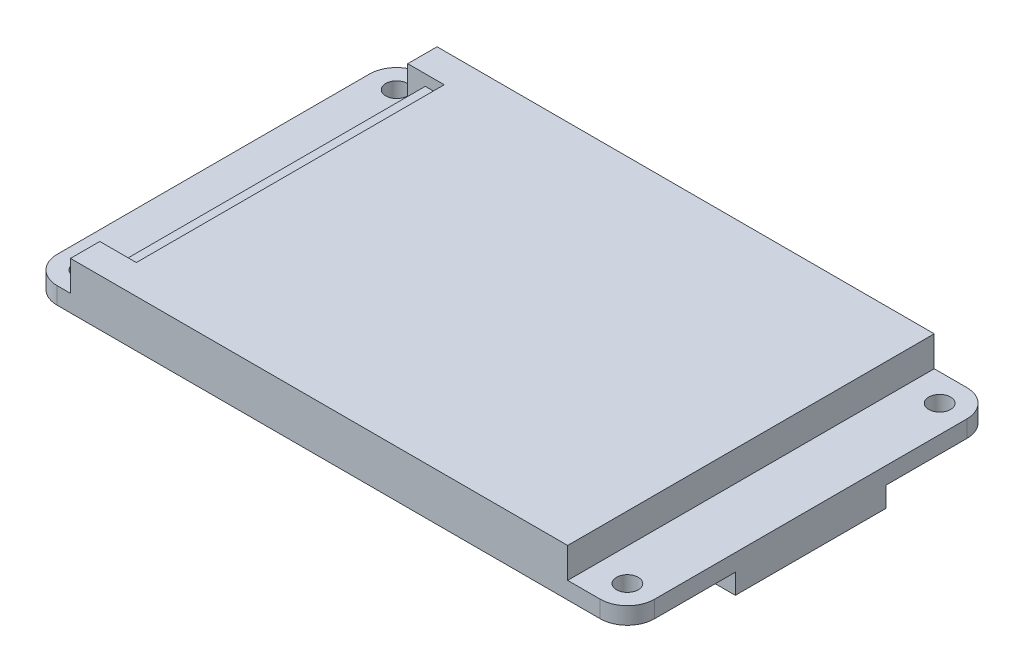
ISO-10303-21;
HEADER;
FILE_DESCRIPTION(('STEP AP214'),'2;1');
FILE_NAME('part.step','',(''),(''),'','','');
FILE_SCHEMA(('AUTOMOTIVE_DESIGN { 1 0 10303 214 1 1 1 1 }'));
ENDSEC;
DATA;
#1=APPLICATION_CONTEXT('core data for automotive mechanical design processes');
#2=APPLICATION_PROTOCOL_DEFINITION('international standard','automotive_design',2000,#1);
#3=PRODUCT_CONTEXT('',#1,'mechanical');
#4=PRODUCT('Part','Part','',(#3));
#5=PRODUCT_RELATED_PRODUCT_CATEGORY('part','',(#4));
#6=PRODUCT_DEFINITION_FORMATION('','',#4);
#7=PRODUCT_DEFINITION_CONTEXT('part definition',#1,'design');
#8=PRODUCT_DEFINITION('design','',#6,#7);
#9=PRODUCT_DEFINITION_SHAPE('','',#8);
#10=(LENGTH_UNIT() NAMED_UNIT(*) SI_UNIT(.MILLI.,.METRE.));
#11=(NAMED_UNIT(*) PLANE_ANGLE_UNIT() SI_UNIT($,.RADIAN.));
#12=(NAMED_UNIT(*) SI_UNIT($,.STERADIAN.) SOLID_ANGLE_UNIT());
#13=UNCERTAINTY_MEASURE_WITH_UNIT(LENGTH_MEASURE(1.E-05),#10,'distance_accuracy_value','');
#14=(GEOMETRIC_REPRESENTATION_CONTEXT(3) GLOBAL_UNCERTAINTY_ASSIGNED_CONTEXT((#13)) GLOBAL_UNIT_ASSIGNED_CONTEXT((#10,
#11,#12)) REPRESENTATION_CONTEXT('',''));
#15=CARTESIAN_POINT('',(0.,0.,0.));
#16=DIRECTION('',(0.,0.,1.));
#17=DIRECTION('',(1.,0.,0.));
#18=AXIS2_PLACEMENT_3D('',#15,#16,#17);
#19=CARTESIAN_POINT('',(53.34,0.,-2.54));
#20=DIRECTION('',(0.,1.,0.));
#21=DIRECTION('',(0.,0.,1.));
#22=AXIS2_PLACEMENT_3D('',#19,#20,#21);
#23=PLANE('',#22);
#24=DIRECTION('',(-1.,0.,0.));
#25=VECTOR('',#24,1.);
#26=CARTESIAN_POINT('',(1.27000000000002,0.,-4.445));
#27=LINE('',#26,#25);
#28=CARTESIAN_POINT('',(3.81000000000002,0.,-4.445));
#29=VERTEX_POINT('',#28);
#30=CARTESIAN_POINT('',(1.27000000000002,0.,-4.445));
#31=VERTEX_POINT('',#30);
#32=EDGE_CURVE('E58',#29,#31,#27,.T.);
#33=ORIENTED_EDGE('',*,*,#32,.F.);
#34=DIRECTION('',(0.,0.,1.));
#35=VECTOR('',#34,1.);
#36=CARTESIAN_POINT('',(3.81000000000002,0.,-29.845));
#37=LINE('',#36,#35);
#38=CARTESIAN_POINT('',(3.81000000000002,0.,-29.845));
#39=VERTEX_POINT('',#38);
#40=EDGE_CURVE('E251',#39,#29,#37,.T.);
#41=ORIENTED_EDGE('',*,*,#40,.F.);
#42=DIRECTION('',(1.,0.,0.));
#43=VECTOR('',#42,1.);
#44=CARTESIAN_POINT('',(1.27000000000002,0.,-29.845));
#45=LINE('',#44,#43);
#46=CARTESIAN_POINT('',(1.27000000000002,0.,-29.845));
#47=VERTEX_POINT('',#46);
#48=EDGE_CURVE('E232',#47,#39,#45,.T.);
#49=ORIENTED_EDGE('',*,*,#48,.F.);
#50=DIRECTION('',(0.,0.,-1.));
#51=VECTOR('',#50,1.);
#52=CARTESIAN_POINT('',(1.27000000000002,0.,-29.845));
#53=LINE('',#52,#51);
#54=EDGE_CURVE('E229',#31,#47,#53,.T.);
#55=ORIENTED_EDGE('',*,*,#54,.F.);
#56=EDGE_LOOP('',(#33,#41,#49,#55));
#57=FACE_BOUND('',#56,.T.);
#58=CARTESIAN_POINT('',(2.54,0.,-2.54));
#59=DIRECTION('',(0.,1.,0.));
#60=DIRECTION('',(0.,0.,1.));
#61=AXIS2_PLACEMENT_3D('',#58,#59,#60);
#62=CIRCLE('',#61,1.016);
#63=CARTESIAN_POINT('',(2.54,0.,-1.524));
#64=VERTEX_POINT('',#63);
#65=EDGE_CURVE('E274',#64,#64,#62,.T.);
#66=ORIENTED_EDGE('',*,*,#65,.T.);
#67=EDGE_LOOP('',(#66));
#68=FACE_BOUND('',#67,.T.);
#69=CARTESIAN_POINT('',(53.34,0.,-31.75));
#70=DIRECTION('',(0.,1.,0.));
#71=DIRECTION('',(0.,0.,1.));
#72=AXIS2_PLACEMENT_3D('',#69,#70,#71);
#73=CIRCLE('',#72,1.016);
#74=CARTESIAN_POINT('',(53.34,0.,-30.734));
#75=VERTEX_POINT('',#74);
#76=EDGE_CURVE('E281',#75,#75,#73,.T.);
#77=ORIENTED_EDGE('',*,*,#76,.T.);
#78=EDGE_LOOP('',(#77));
#79=FACE_BOUND('',#78,.T.);
#80=CARTESIAN_POINT('',(53.34,0.,-2.54));
#81=DIRECTION('',(0.,1.,0.));
#82=DIRECTION('',(0.,0.,1.));
#83=AXIS2_PLACEMENT_3D('',#80,#81,#82);
#84=CIRCLE('',#83,1.016);
#85=CARTESIAN_POINT('',(53.34,0.,-1.524));
#86=VERTEX_POINT('',#85);
#87=EDGE_CURVE('E268',#86,#86,#84,.T.);
#88=ORIENTED_EDGE('',*,*,#87,.T.);
#89=EDGE_LOOP('',(#88));
#90=FACE_BOUND('',#89,.T.);
#91=CARTESIAN_POINT('',(2.54,0.,-31.75));
#92=DIRECTION('',(0.,1.,0.));
#93=DIRECTION('',(0.,0.,1.));
#94=AXIS2_PLACEMENT_3D('',#91,#92,#93);
#95=CIRCLE('',#94,1.016);
#96=CARTESIAN_POINT('',(2.54,0.,-30.734));
#97=VERTEX_POINT('',#96);
#98=EDGE_CURVE('E286',#97,#97,#95,.T.);
#99=ORIENTED_EDGE('',*,*,#98,.T.);
#100=EDGE_LOOP('',(#99));
#101=FACE_BOUND('',#100,.T.);
#102=DIRECTION('',(-1.,0.,0.));
#103=VECTOR('',#102,1.);
#104=CARTESIAN_POINT('',(55.88,0.,-10.0965));
#105=LINE('',#104,#103);
#106=CARTESIAN_POINT('',(55.88,0.,-10.0965));
#107=VERTEX_POINT('',#106);
#108=CARTESIAN_POINT('',(39.3192,0.,-10.0965));
#109=VERTEX_POINT('',#108);
#110=EDGE_CURVE('E473',#107,#109,#105,.T.);
#111=ORIENTED_EDGE('',*,*,#110,.F.);
#112=DIRECTION('',(0.,0.,-1.));
#113=VECTOR('',#112,1.);
#114=CARTESIAN_POINT('',(55.88,0.,-2.54));
#115=LINE('',#114,#113);
#116=CARTESIAN_POINT('',(55.88,0.,-2.54));
#117=VERTEX_POINT('',#116);
#118=EDGE_CURVE('E228',#117,#107,#115,.T.);
#119=ORIENTED_EDGE('',*,*,#118,.F.);
#120=CARTESIAN_POINT('',(53.34,0.,-2.54));
#121=DIRECTION('',(0.,1.,0.));
#122=DIRECTION('',(0.,0.,1.));
#123=AXIS2_PLACEMENT_3D('',#120,#121,#122);
#124=CIRCLE('',#123,2.54000000000001);
#125=CARTESIAN_POINT('',(53.34,0.,0.));
#126=VERTEX_POINT('',#125);
#127=EDGE_CURVE('E332',#126,#117,#124,.T.);
#128=ORIENTED_EDGE('',*,*,#127,.F.);
#129=DIRECTION('',(1.,0.,0.));
#130=VECTOR('',#129,1.);
#131=CARTESIAN_POINT('',(2.54,0.,0.));
#132=LINE('',#131,#130);
#133=CARTESIAN_POINT('',(2.54,0.,0.));
#134=VERTEX_POINT('',#133);
#135=EDGE_CURVE('E374',#134,#126,#132,.T.);
#136=ORIENTED_EDGE('',*,*,#135,.F.);
#137=CARTESIAN_POINT('',(2.54,0.,-2.54));
#138=DIRECTION('',(0.,1.,0.));
#139=DIRECTION('',(0.,0.,-1.));
#140=AXIS2_PLACEMENT_3D('',#137,#138,#139);
#141=CIRCLE('',#140,2.54);
#142=CARTESIAN_POINT('',(0.,0.,-2.54));
#143=VERTEX_POINT('',#142);
#144=EDGE_CURVE('E403',#143,#134,#141,.T.);
#145=ORIENTED_EDGE('',*,*,#144,.F.);
#146=DIRECTION('',(0.,0.,1.));
#147=VECTOR('',#146,1.);
#148=CARTESIAN_POINT('',(0.,0.,-2.54));
#149=LINE('',#148,#147);
#150=CARTESIAN_POINT('',(0.,0.,-31.75));
#151=VERTEX_POINT('',#150);
#152=EDGE_CURVE('E401',#151,#143,#149,.T.);
#153=ORIENTED_EDGE('',*,*,#152,.F.);
#154=CARTESIAN_POINT('',(2.54,0.,-31.75));
#155=DIRECTION('',(0.,1.,0.));
#156=DIRECTION('',(0.,0.,-1.));
#157=AXIS2_PLACEMENT_3D('',#154,#155,#156);
#158=CIRCLE('',#157,2.54);
#159=CARTESIAN_POINT('',(2.54,0.,-34.29));
#160=VERTEX_POINT('',#159);
#161=EDGE_CURVE('E399',#160,#151,#158,.T.);
#162=ORIENTED_EDGE('',*,*,#161,.F.);
#163=DIRECTION('',(-1.,0.,0.));
#164=VECTOR('',#163,1.);
#165=CARTESIAN_POINT('',(2.54,0.,-34.29));
#166=LINE('',#165,#164);
#167=CARTESIAN_POINT('',(53.34,0.,-34.29));
#168=VERTEX_POINT('',#167);
#169=EDGE_CURVE('E397',#168,#160,#166,.T.);
#170=ORIENTED_EDGE('',*,*,#169,.F.);
#171=CARTESIAN_POINT('',(53.34,0.,-31.75));
#172=DIRECTION('',(0.,1.,0.));
#173=DIRECTION('',(0.,0.,-1.));
#174=AXIS2_PLACEMENT_3D('',#171,#172,#173);
#175=CIRCLE('',#174,2.54);
#176=CARTESIAN_POINT('',(55.88,0.,-31.75));
#177=VERTEX_POINT('',#176);
#178=EDGE_CURVE('E395',#177,#168,#175,.T.);
#179=ORIENTED_EDGE('',*,*,#178,.F.);
#180=CARTESIAN_POINT('',(55.88,0.,-24.1935));
#181=VERTEX_POINT('',#180);
#182=EDGE_CURVE('E393',#181,#177,#115,.T.);
#183=ORIENTED_EDGE('',*,*,#182,.F.);
#184=DIRECTION('',(1.,0.,0.));
#185=VECTOR('',#184,1.);
#186=CARTESIAN_POINT('',(55.88,0.,-24.1935));
#187=LINE('',#186,#185);
#188=CARTESIAN_POINT('',(39.3192,0.,-24.1935));
#189=VERTEX_POINT('',#188);
#190=EDGE_CURVE('E224',#189,#181,#187,.T.);
#191=ORIENTED_EDGE('',*,*,#190,.F.);
#192=DIRECTION('',(0.,0.,-1.));
#193=VECTOR('',#192,1.);
#194=CARTESIAN_POINT('',(39.3192,0.,-24.1935));
#195=LINE('',#194,#193);
#196=EDGE_CURVE('E474',#109,#189,#195,.T.);
#197=ORIENTED_EDGE('',*,*,#196,.F.);
#198=EDGE_LOOP('',(#111,#119,#128,#136,#145,#153,#162,#170,#179,#183,#191,#197));
#199=FACE_BOUND('',#198,.T.);
#200=ADVANCED_FACE('F35',(#57,#68,#79,#90,#101,#199),#23,.F.);
#201=CARTESIAN_POINT('',(53.34,1.5875,-2.54));
#202=DIRECTION('',(0.,1.,0.));
#203=DIRECTION('',(0.,0.,1.));
#204=AXIS2_PLACEMENT_3D('',#201,#202,#203);
#205=PLANE('',#204);
#206=CARTESIAN_POINT('',(2.54,1.5875,-2.54));
#207=DIRECTION('',(0.,1.,0.));
#208=DIRECTION('',(0.,0.,1.));
#209=AXIS2_PLACEMENT_3D('',#206,#207,#208);
#210=CIRCLE('',#209,1.016);
#211=CARTESIAN_POINT('',(2.54,1.5875,-1.524));
#212=VERTEX_POINT('',#211);
#213=EDGE_CURVE('E278',#212,#212,#210,.T.);
#214=ORIENTED_EDGE('',*,*,#213,.F.);
#215=EDGE_LOOP('',(#214));
#216=FACE_BOUND('',#215,.T.);
#217=CARTESIAN_POINT('',(2.54,1.5875,-31.75));
#218=DIRECTION('',(0.,1.,0.));
#219=DIRECTION('',(0.,0.,1.));
#220=AXIS2_PLACEMENT_3D('',#217,#218,#219);
#221=CIRCLE('',#220,1.016);
#222=CARTESIAN_POINT('',(2.54,1.5875,-30.734));
#223=VERTEX_POINT('',#222);
#224=EDGE_CURVE('E277',#223,#223,#221,.T.);
#225=ORIENTED_EDGE('',*,*,#224,.F.);
#226=EDGE_LOOP('',(#225));
#227=FACE_BOUND('',#226,.T.);
#228=DIRECTION('',(-1.,0.,0.));
#229=VECTOR('',#228,1.);
#230=CARTESIAN_POINT('',(3.78460000000002,1.5875,-2.7432));
#231=LINE('',#230,#229);
#232=CARTESIAN_POINT('',(5.42290000000003,1.5875,-2.7432));
#233=VERTEX_POINT('',#232);
#234=CARTESIAN_POINT('',(3.78460000000002,1.5875,-2.7432));
#235=VERTEX_POINT('',#234);
#236=EDGE_CURVE('E313',#233,#235,#231,.T.);
#237=ORIENTED_EDGE('',*,*,#236,.F.);
#238=DIRECTION('',(0.,0.,1.));
#239=VECTOR('',#238,1.);
#240=CARTESIAN_POINT('',(5.42290000000002,1.5875,-31.5468));
#241=LINE('',#240,#239);
#242=CARTESIAN_POINT('',(5.42290000000002,1.5875,-31.5468));
#243=VERTEX_POINT('',#242);
#244=EDGE_CURVE('E292',#243,#233,#241,.T.);
#245=ORIENTED_EDGE('',*,*,#244,.F.);
#246=DIRECTION('',(1.,0.,0.));
#247=VECTOR('',#246,1.);
#248=CARTESIAN_POINT('',(3.78460000000002,1.5875,-31.5468));
#249=LINE('',#248,#247);
#250=CARTESIAN_POINT('',(3.78460000000002,1.5875,-31.5468));
#251=VERTEX_POINT('',#250);
#252=EDGE_CURVE('E316',#251,#243,#249,.T.);
#253=ORIENTED_EDGE('',*,*,#252,.F.);
#254=DIRECTION('',(0.,0.,1.));
#255=VECTOR('',#254,1.);
#256=CARTESIAN_POINT('',(3.78460000000002,1.5875,-34.29));
#257=LINE('',#256,#255);
#258=CARTESIAN_POINT('',(3.78460000000002,1.5875,-34.29));
#259=VERTEX_POINT('',#258);
#260=EDGE_CURVE('E321',#259,#251,#257,.T.);
#261=ORIENTED_EDGE('',*,*,#260,.F.);
#262=DIRECTION('',(-1.,0.,0.));
#263=VECTOR('',#262,1.);
#264=CARTESIAN_POINT('',(2.54,1.5875,-34.29));
#265=LINE('',#264,#263);
#266=CARTESIAN_POINT('',(2.54,1.5875,-34.29));
#267=VERTEX_POINT('',#266);
#268=EDGE_CURVE('E378',#259,#267,#265,.T.);
#269=ORIENTED_EDGE('',*,*,#268,.T.);
#270=CARTESIAN_POINT('',(2.54,1.5875,-31.75));
#271=DIRECTION('',(0.,1.,0.));
#272=DIRECTION('',(0.,0.,-1.));
#273=AXIS2_PLACEMENT_3D('',#270,#271,#272);
#274=CIRCLE('',#273,2.54);
#275=CARTESIAN_POINT('',(0.,1.5875,-31.75));
#276=VERTEX_POINT('',#275);
#277=EDGE_CURVE('E381',#267,#276,#274,.T.);
#278=ORIENTED_EDGE('',*,*,#277,.T.);
#279=DIRECTION('',(0.,0.,1.));
#280=VECTOR('',#279,1.);
#281=CARTESIAN_POINT('',(0.,1.5875,-2.54));
#282=LINE('',#281,#280);
#283=CARTESIAN_POINT('',(0.,1.5875,-2.54));
#284=VERTEX_POINT('',#283);
#285=EDGE_CURVE('E383',#276,#284,#282,.T.);
#286=ORIENTED_EDGE('',*,*,#285,.T.);
#287=CARTESIAN_POINT('',(2.54,1.5875,-2.54));
#288=DIRECTION('',(0.,1.,0.));
#289=DIRECTION('',(0.,0.,-1.));
#290=AXIS2_PLACEMENT_3D('',#287,#288,#289);
#291=CIRCLE('',#290,2.54);
#292=CARTESIAN_POINT('',(2.54,1.5875,0.));
#293=VERTEX_POINT('',#292);
#294=EDGE_CURVE('E385',#284,#293,#291,.T.);
#295=ORIENTED_EDGE('',*,*,#294,.T.);
#296=DIRECTION('',(1.,0.,0.));
#297=VECTOR('',#296,1.);
#298=CARTESIAN_POINT('',(2.54,1.5875,0.));
#299=LINE('',#298,#297);
#300=CARTESIAN_POINT('',(3.78460000000002,1.5875,0.));
#301=VERTEX_POINT('',#300);
#302=EDGE_CURVE('E388',#293,#301,#299,.T.);
#303=ORIENTED_EDGE('',*,*,#302,.T.);
#304=DIRECTION('',(0.,0.,1.));
#305=VECTOR('',#304,1.);
#306=CARTESIAN_POINT('',(3.78460000000002,1.5875,-2.7432));
#307=LINE('',#306,#305);
#308=EDGE_CURVE('E308',#235,#301,#307,.T.);
#309=ORIENTED_EDGE('',*,*,#308,.F.);
#310=EDGE_LOOP('',(#237,#245,#253,#261,#269,#278,#286,#295,#303,#309));
#311=FACE_BOUND('',#310,.T.);
#312=ADVANCED_FACE('F447',(#216,#227,#311),#205,.T.);
#313=CARTESIAN_POINT('',(3.78460000000002,66.6210514307044,-31.5468));
#314=DIRECTION('',(0.,0.,-1.));
#315=DIRECTION('',(-1.,0.,0.));
#316=AXIS2_PLACEMENT_3D('',#313,#314,#315);
#317=PLANE('',#316);
#318=DIRECTION('',(0.,-1.,0.));
#319=VECTOR('',#318,1.);
#320=CARTESIAN_POINT('',(5.42290000000002,33.278024367245,-31.5468));
#321=LINE('',#320,#319);
#322=CARTESIAN_POINT('',(5.42290000000002,3.4036,-31.5468));
#323=VERTEX_POINT('',#322);
#324=EDGE_CURVE('E289',#323,#243,#321,.T.);
#325=ORIENTED_EDGE('',*,*,#324,.F.);
#326=DIRECTION('',(-1.,0.,0.));
#327=VECTOR('',#326,1.);
#328=CARTESIAN_POINT('',(5.42290000000002,3.4036,-31.5468));
#329=LINE('',#328,#327);
#330=CARTESIAN_POINT('',(7.20090000000002,3.4036,-31.5468));
#331=VERTEX_POINT('',#330);
#332=EDGE_CURVE('E302',#331,#323,#329,.T.);
#333=ORIENTED_EDGE('',*,*,#332,.F.);
#334=DIRECTION('',(0.,-1.,0.));
#335=VECTOR('',#334,1.);
#336=CARTESIAN_POINT('',(7.20090000000002,66.6210514307044,-31.5468));
#337=LINE('',#336,#335);
#338=CARTESIAN_POINT('',(7.20090000000002,4.4196,-31.5468));
#339=VERTEX_POINT('',#338);
#340=EDGE_CURVE('E319',#339,#331,#337,.T.);
#341=ORIENTED_EDGE('',*,*,#340,.F.);
#342=DIRECTION('',(1.,0.,0.));
#343=VECTOR('',#342,1.);
#344=CARTESIAN_POINT('',(3.78460000000002,4.4196,-31.5468));
#345=LINE('',#344,#343);
#346=CARTESIAN_POINT('',(3.78460000000002,4.4196,-31.5468));
#347=VERTEX_POINT('',#346);
#348=EDGE_CURVE('E339',#347,#339,#345,.T.);
#349=ORIENTED_EDGE('',*,*,#348,.F.);
#350=DIRECTION('',(0.,-1.,0.));
#351=VECTOR('',#350,1.);
#352=CARTESIAN_POINT('',(3.78460000000002,66.6210514307044,-31.5468));
#353=LINE('',#352,#351);
#354=EDGE_CURVE('E320',#347,#251,#353,.T.);
#355=ORIENTED_EDGE('',*,*,#354,.T.);
#356=ORIENTED_EDGE('',*,*,#252,.T.);
#357=EDGE_LOOP('',(#325,#333,#341,#349,#355,#356));
#358=FACE_BOUND('',#357,.T.);
#359=ADVANCED_FACE('F503',(#358),#317,.F.);
#360=CARTESIAN_POINT('',(3.78460000000002,66.6210514307044,-2.7432));
#361=DIRECTION('',(0.,0.,1.));
#362=DIRECTION('',(1.,0.,0.));
#363=AXIS2_PLACEMENT_3D('',#360,#361,#362);
#364=PLANE('',#363);
#365=DIRECTION('',(0.,-1.,0.));
#366=VECTOR('',#365,1.);
#367=CARTESIAN_POINT('',(5.42290000000003,33.278024367245,-2.7432));
#368=LINE('',#367,#366);
#369=CARTESIAN_POINT('',(5.42290000000002,3.40359999999999,-2.7432));
#370=VERTEX_POINT('',#369);
#371=EDGE_CURVE('E294',#370,#233,#368,.T.);
#372=ORIENTED_EDGE('',*,*,#371,.T.);
#373=ORIENTED_EDGE('',*,*,#236,.T.);
#374=DIRECTION('',(0.,-1.,0.));
#375=VECTOR('',#374,1.);
#376=CARTESIAN_POINT('',(3.78460000000002,66.6210514307044,-2.7432));
#377=LINE('',#376,#375);
#378=CARTESIAN_POINT('',(3.78460000000002,4.4196,-2.7432));
#379=VERTEX_POINT('',#378);
#380=EDGE_CURVE('E312',#379,#235,#377,.T.);
#381=ORIENTED_EDGE('',*,*,#380,.F.);
#382=DIRECTION('',(-1.,0.,0.));
#383=VECTOR('',#382,1.);
#384=CARTESIAN_POINT('',(3.78460000000002,4.4196,-2.7432));
#385=LINE('',#384,#383);
#386=CARTESIAN_POINT('',(7.20090000000002,4.4196,-2.7432));
#387=VERTEX_POINT('',#386);
#388=EDGE_CURVE('E333',#387,#379,#385,.T.);
#389=ORIENTED_EDGE('',*,*,#388,.F.);
#390=DIRECTION('',(0.,-1.,0.));
#391=VECTOR('',#390,1.);
#392=CARTESIAN_POINT('',(7.20090000000002,66.6210514307044,-2.7432));
#393=LINE('',#392,#391);
#394=CARTESIAN_POINT('',(7.20090000000002,3.4036,-2.7432));
#395=VERTEX_POINT('',#394);
#396=EDGE_CURVE('E315',#387,#395,#393,.T.);
#397=ORIENTED_EDGE('',*,*,#396,.T.);
#398=DIRECTION('',(1.,0.,0.));
#399=VECTOR('',#398,1.);
#400=CARTESIAN_POINT('',(5.42290000000003,3.4036,-2.7432));
#401=LINE('',#400,#399);
#402=EDGE_CURVE('E298',#370,#395,#401,.T.);
#403=ORIENTED_EDGE('',*,*,#402,.F.);
#404=EDGE_LOOP('',(#372,#373,#381,#389,#397,#403));
#405=FACE_BOUND('',#404,.T.);
#406=ADVANCED_FACE('F530',(#405),#364,.F.);
#407=CARTESIAN_POINT('',(53.34,1.5875,-31.75));
#408=DIRECTION('',(0.,1.,0.));
#409=DIRECTION('',(0.,0.,1.));
#410=AXIS2_PLACEMENT_3D('',#407,#408,#409);
#411=CIRCLE('',#410,1.016);
#412=CARTESIAN_POINT('',(53.34,1.5875,-30.734));
#413=VERTEX_POINT('',#412);
#414=EDGE_CURVE('E271',#413,#413,#411,.T.);
#415=ORIENTED_EDGE('',*,*,#414,.F.);
#416=EDGE_LOOP('',(#415));
#417=FACE_BOUND('',#416,.T.);
#418=CARTESIAN_POINT('',(53.34,1.5875,-2.54));
#419=DIRECTION('',(0.,1.,0.));
#420=DIRECTION('',(0.,0.,1.));
#421=AXIS2_PLACEMENT_3D('',#418,#419,#420);
#422=CIRCLE('',#421,1.016);
#423=CARTESIAN_POINT('',(53.34,1.5875,-1.524));
#424=VERTEX_POINT('',#423);
#425=EDGE_CURVE('E247',#424,#424,#422,.T.);
#426=ORIENTED_EDGE('',*,*,#425,.F.);
#427=EDGE_LOOP('',(#426));
#428=FACE_BOUND('',#427,.T.);
#429=DIRECTION('',(0.,0.,-1.));
#430=VECTOR('',#429,1.);
#431=CARTESIAN_POINT('',(50.292,1.5875,-34.29));
#432=LINE('',#431,#430);
#433=CARTESIAN_POINT('',(50.292,1.5875,0.));
#434=VERTEX_POINT('',#433);
#435=CARTESIAN_POINT('',(50.292,1.5875,-34.29));
#436=VERTEX_POINT('',#435);
#437=EDGE_CURVE('E325',#434,#436,#432,.T.);
#438=ORIENTED_EDGE('',*,*,#437,.F.);
#439=CARTESIAN_POINT('',(53.34,1.5875,0.));
#440=VERTEX_POINT('',#439);
#441=EDGE_CURVE('E387',#434,#440,#299,.T.);
#442=ORIENTED_EDGE('',*,*,#441,.T.);
#443=CARTESIAN_POINT('',(53.34,1.5875,-2.54));
#444=DIRECTION('',(0.,1.,0.));
#445=DIRECTION('',(0.,0.,1.));
#446=AXIS2_PLACEMENT_3D('',#443,#444,#445);
#447=CIRCLE('',#446,2.54000000000001);
#448=CARTESIAN_POINT('',(55.88,1.5875,-2.54));
#449=VERTEX_POINT('',#448);
#450=EDGE_CURVE('E370',#440,#449,#447,.T.);
#451=ORIENTED_EDGE('',*,*,#450,.T.);
#452=DIRECTION('',(0.,0.,-1.));
#453=VECTOR('',#452,1.);
#454=CARTESIAN_POINT('',(55.88,1.5875,-2.54));
#455=LINE('',#454,#453);
#456=CARTESIAN_POINT('',(55.88,1.5875,-31.75));
#457=VERTEX_POINT('',#456);
#458=EDGE_CURVE('E373',#449,#457,#455,.T.);
#459=ORIENTED_EDGE('',*,*,#458,.T.);
#460=CARTESIAN_POINT('',(53.34,1.5875,-31.75));
#461=DIRECTION('',(0.,1.,0.));
#462=DIRECTION('',(0.,0.,-1.));
#463=AXIS2_PLACEMENT_3D('',#460,#461,#462);
#464=CIRCLE('',#463,2.54);
#465=CARTESIAN_POINT('',(53.34,1.5875,-34.29));
#466=VERTEX_POINT('',#465);
#467=EDGE_CURVE('E376',#457,#466,#464,.T.);
#468=ORIENTED_EDGE('',*,*,#467,.T.);
#469=EDGE_CURVE('E379',#466,#436,#265,.T.);
#470=ORIENTED_EDGE('',*,*,#469,.T.);
#471=EDGE_LOOP('',(#438,#442,#451,#459,#468,#470));
#472=FACE_BOUND('',#471,.T.);
#473=ADVANCED_FACE('F461',(#417,#428,#472),#205,.T.);
#474=CARTESIAN_POINT('',(53.34,1.5875,-2.54));
#475=DIRECTION('',(0.,-1.,0.));
#476=DIRECTION('',(0.,0.,-1.));
#477=AXIS2_PLACEMENT_3D('',#474,#475,#476);
#478=CYLINDRICAL_SURFACE('',#477,2.54000000000001);
#479=ORIENTED_EDGE('',*,*,#127,.T.);
#480=DIRECTION('',(0.,-1.,0.));
#481=VECTOR('',#480,1.);
#482=CARTESIAN_POINT('',(55.88,1.5875,-2.54));
#483=LINE('',#482,#481);
#484=EDGE_CURVE('E12',#449,#117,#483,.T.);
#485=ORIENTED_EDGE('',*,*,#484,.F.);
#486=ORIENTED_EDGE('',*,*,#450,.F.);
#487=DIRECTION('',(0.,-1.,0.));
#488=VECTOR('',#487,1.);
#489=CARTESIAN_POINT('',(53.34,1.5875,0.));
#490=LINE('',#489,#488);
#491=EDGE_CURVE('E390',#440,#126,#490,.T.);
#492=ORIENTED_EDGE('',*,*,#491,.T.);
#493=EDGE_LOOP('',(#479,#485,#486,#492));
#494=FACE_BOUND('',#493,.T.);
#495=ADVANCED_FACE('F37',(#494),#478,.T.);
#496=CARTESIAN_POINT('',(55.88,1.5875,-2.54));
#497=DIRECTION('',(-1.,0.,0.));
#498=DIRECTION('',(0.,0.,1.));
#499=AXIS2_PLACEMENT_3D('',#496,#497,#498);
#500=PLANE('',#499);
#501=ORIENTED_EDGE('',*,*,#118,.T.);
#502=DIRECTION('',(0.,1.,0.));
#503=VECTOR('',#502,1.);
#504=CARTESIAN_POINT('',(55.88,-1.8796,-10.0965));
#505=LINE('',#504,#503);
#506=CARTESIAN_POINT('',(55.88,-1.8796,-10.0965));
#507=VERTEX_POINT('',#506);
#508=EDGE_CURVE('E212',#507,#107,#505,.T.);
#509=ORIENTED_EDGE('',*,*,#508,.F.);
#510=DIRECTION('',(0.,0.,1.));
#511=VECTOR('',#510,1.);
#512=CARTESIAN_POINT('',(55.88,-1.8796,-24.1935));
#513=LINE('',#512,#511);
#514=CARTESIAN_POINT('',(55.88,-1.8796,-24.1935));
#515=VERTEX_POINT('',#514);
#516=EDGE_CURVE('E219',#515,#507,#513,.T.);
#517=ORIENTED_EDGE('',*,*,#516,.F.);
#518=DIRECTION('',(0.,1.,0.));
#519=VECTOR('',#518,1.);
#520=CARTESIAN_POINT('',(55.88,-1.8796,-24.1935));
#521=LINE('',#520,#519);
#522=EDGE_CURVE('E50',#515,#181,#521,.T.);
#523=ORIENTED_EDGE('',*,*,#522,.T.);
#524=ORIENTED_EDGE('',*,*,#182,.T.);
#525=DIRECTION('',(0.,-1.,0.));
#526=VECTOR('',#525,1.);
#527=CARTESIAN_POINT('',(55.88,1.5875,-31.75));
#528=LINE('',#527,#526);
#529=EDGE_CURVE('E43',#457,#177,#528,.T.);
#530=ORIENTED_EDGE('',*,*,#529,.F.);
#531=ORIENTED_EDGE('',*,*,#458,.F.);
#532=ORIENTED_EDGE('',*,*,#484,.T.);
#533=EDGE_LOOP('',(#501,#509,#517,#523,#524,#530,#531,#532));
#534=FACE_BOUND('',#533,.T.);
#535=ADVANCED_FACE('F227',(#534),#500,.F.);
#536=CARTESIAN_POINT('',(53.34,1.5875,-31.75));
#537=DIRECTION('',(0.,-1.,0.));
#538=DIRECTION('',(0.,0.,-1.));
#539=AXIS2_PLACEMENT_3D('',#536,#537,#538);
#540=CYLINDRICAL_SURFACE('',#539,2.54);
#541=ORIENTED_EDGE('',*,*,#178,.T.);
#542=DIRECTION('',(0.,-1.,0.));
#543=VECTOR('',#542,1.);
#544=CARTESIAN_POINT('',(53.34,1.5875,-34.29));
#545=LINE('',#544,#543);
#546=EDGE_CURVE('E420',#466,#168,#545,.T.);
#547=ORIENTED_EDGE('',*,*,#546,.F.);
#548=ORIENTED_EDGE('',*,*,#467,.F.);
#549=ORIENTED_EDGE('',*,*,#529,.T.);
#550=EDGE_LOOP('',(#541,#547,#548,#549));
#551=FACE_BOUND('',#550,.T.);
#552=ADVANCED_FACE('F427',(#551),#540,.T.);
#553=CARTESIAN_POINT('',(2.54,1.5875,-34.29));
#554=DIRECTION('',(0.,0.,1.));
#555=DIRECTION('',(1.,0.,0.));
#556=AXIS2_PLACEMENT_3D('',#553,#554,#555);
#557=PLANE('',#556);
#558=ORIENTED_EDGE('',*,*,#169,.T.);
#559=DIRECTION('',(0.,-1.,0.));
#560=VECTOR('',#559,1.);
#561=CARTESIAN_POINT('',(2.54,1.5875,-34.29));
#562=LINE('',#561,#560);
#563=EDGE_CURVE('E417',#267,#160,#562,.T.);
#564=ORIENTED_EDGE('',*,*,#563,.F.);
#565=ORIENTED_EDGE('',*,*,#268,.F.);
#566=DIRECTION('',(0.,-1.,0.));
#567=VECTOR('',#566,1.);
#568=CARTESIAN_POINT('',(3.78460000000002,66.6210514307044,-34.29));
#569=LINE('',#568,#567);
#570=CARTESIAN_POINT('',(3.78460000000002,4.4196,-34.29));
#571=VERTEX_POINT('',#570);
#572=EDGE_CURVE('E324',#571,#259,#569,.T.);
#573=ORIENTED_EDGE('',*,*,#572,.F.);
#574=DIRECTION('',(-1.,0.,0.));
#575=VECTOR('',#574,1.);
#576=CARTESIAN_POINT('',(50.292,4.4196,-34.29));
#577=LINE('',#576,#575);
#578=CARTESIAN_POINT('',(50.292,4.4196,-34.29));
#579=VERTEX_POINT('',#578);
#580=EDGE_CURVE('E345',#579,#571,#577,.T.);
#581=ORIENTED_EDGE('',*,*,#580,.F.);
#582=DIRECTION('',(0.,-1.,0.));
#583=VECTOR('',#582,1.);
#584=CARTESIAN_POINT('',(50.292,66.6210514307044,-34.29));
#585=LINE('',#584,#583);
#586=EDGE_CURVE('E328',#579,#436,#585,.T.);
#587=ORIENTED_EDGE('',*,*,#586,.T.);
#588=ORIENTED_EDGE('',*,*,#469,.F.);
#589=ORIENTED_EDGE('',*,*,#546,.T.);
#590=EDGE_LOOP('',(#558,#564,#565,#573,#581,#587,#588,#589));
#591=FACE_BOUND('',#590,.T.);
#592=ADVANCED_FACE('F437',(#591),#557,.F.);
#593=CARTESIAN_POINT('',(2.54,1.5875,-31.75));
#594=DIRECTION('',(0.,-1.,0.));
#595=DIRECTION('',(0.,0.,-1.));
#596=AXIS2_PLACEMENT_3D('',#593,#594,#595);
#597=CYLINDRICAL_SURFACE('',#596,2.54);
#598=ORIENTED_EDGE('',*,*,#161,.T.);
#599=DIRECTION('',(0.,-1.,0.));
#600=VECTOR('',#599,1.);
#601=CARTESIAN_POINT('',(0.,1.5875,-31.75));
#602=LINE('',#601,#600);
#603=EDGE_CURVE('E414',#276,#151,#602,.T.);
#604=ORIENTED_EDGE('',*,*,#603,.F.);
#605=ORIENTED_EDGE('',*,*,#277,.F.);
#606=ORIENTED_EDGE('',*,*,#563,.T.);
#607=EDGE_LOOP('',(#598,#604,#605,#606));
#608=FACE_BOUND('',#607,.T.);
#609=ADVANCED_FACE('F442',(#608),#597,.T.);
#610=CARTESIAN_POINT('',(0.,1.5875,-2.54));
#611=DIRECTION('',(1.,0.,0.));
#612=DIRECTION('',(0.,0.,-1.));
#613=AXIS2_PLACEMENT_3D('',#610,#611,#612);
#614=PLANE('',#613);
#615=ORIENTED_EDGE('',*,*,#152,.T.);
#616=DIRECTION('',(0.,-1.,0.));
#617=VECTOR('',#616,1.);
#618=CARTESIAN_POINT('',(0.,1.5875,-2.54));
#619=LINE('',#618,#617);
#620=EDGE_CURVE('E411',#284,#143,#619,.T.);
#621=ORIENTED_EDGE('',*,*,#620,.F.);
#622=ORIENTED_EDGE('',*,*,#285,.F.);
#623=ORIENTED_EDGE('',*,*,#603,.T.);
#624=EDGE_LOOP('',(#615,#621,#622,#623));
#625=FACE_BOUND('',#624,.T.);
#626=ADVANCED_FACE('F514',(#625),#614,.F.);
#627=CARTESIAN_POINT('',(2.54,1.5875,-2.54));
#628=DIRECTION('',(0.,-1.,0.));
#629=DIRECTION('',(0.,0.,-1.));
#630=AXIS2_PLACEMENT_3D('',#627,#628,#629);
#631=CYLINDRICAL_SURFACE('',#630,2.54);
#632=ORIENTED_EDGE('',*,*,#144,.T.);
#633=DIRECTION('',(0.,-1.,0.));
#634=VECTOR('',#633,1.);
#635=CARTESIAN_POINT('',(2.54,1.5875,0.));
#636=LINE('',#635,#634);
#637=EDGE_CURVE('E408',#293,#134,#636,.T.);
#638=ORIENTED_EDGE('',*,*,#637,.F.);
#639=ORIENTED_EDGE('',*,*,#294,.F.);
#640=ORIENTED_EDGE('',*,*,#620,.T.);
#641=EDGE_LOOP('',(#632,#638,#639,#640));
#642=FACE_BOUND('',#641,.T.);
#643=ADVANCED_FACE('F511',(#642),#631,.T.);
#644=CARTESIAN_POINT('',(2.54,1.5875,0.));
#645=DIRECTION('',(0.,0.,-1.));
#646=DIRECTION('',(-1.,0.,0.));
#647=AXIS2_PLACEMENT_3D('',#644,#645,#646);
#648=PLANE('',#647);
#649=ORIENTED_EDGE('',*,*,#135,.T.);
#650=ORIENTED_EDGE('',*,*,#491,.F.);
#651=ORIENTED_EDGE('',*,*,#441,.F.);
#652=DIRECTION('',(0.,-1.,0.));
#653=VECTOR('',#652,1.);
#654=CARTESIAN_POINT('',(50.292,66.6210514307044,0.));
#655=LINE('',#654,#653);
#656=CARTESIAN_POINT('',(50.292,4.4196,0.));
#657=VERTEX_POINT('',#656);
#658=EDGE_CURVE('E297',#657,#434,#655,.T.);
#659=ORIENTED_EDGE('',*,*,#658,.F.);
#660=DIRECTION('',(1.,0.,0.));
#661=VECTOR('',#660,1.);
#662=CARTESIAN_POINT('',(50.292,4.4196,0.));
#663=LINE('',#662,#661);
#664=CARTESIAN_POINT('',(3.78460000000002,4.4196,0.));
#665=VERTEX_POINT('',#664);
#666=EDGE_CURVE('E351',#665,#657,#663,.T.);
#667=ORIENTED_EDGE('',*,*,#666,.F.);
#668=DIRECTION('',(0.,-1.,0.));
#669=VECTOR('',#668,1.);
#670=CARTESIAN_POINT('',(3.78460000000002,66.6210514307044,0.));
#671=LINE('',#670,#669);
#672=EDGE_CURVE('E311',#665,#301,#671,.T.);
#673=ORIENTED_EDGE('',*,*,#672,.T.);
#674=ORIENTED_EDGE('',*,*,#302,.F.);
#675=ORIENTED_EDGE('',*,*,#637,.T.);
#676=EDGE_LOOP('',(#649,#650,#651,#659,#667,#673,#674,#675));
#677=FACE_BOUND('',#676,.T.);
#678=ADVANCED_FACE('F464',(#677),#648,.F.);
#679=CARTESIAN_POINT('',(50.292,66.6210514307044,-34.29));
#680=DIRECTION('',(-1.,0.,0.));
#681=DIRECTION('',(0.,0.,1.));
#682=AXIS2_PLACEMENT_3D('',#679,#680,#681);
#683=PLANE('',#682);
#684=DIRECTION('',(0.,0.,-1.));
#685=VECTOR('',#684,1.);
#686=CARTESIAN_POINT('',(50.292,4.4196,-34.29));
#687=LINE('',#686,#685);
#688=EDGE_CURVE('E348',#657,#579,#687,.T.);
#689=ORIENTED_EDGE('',*,*,#688,.F.);
#690=ORIENTED_EDGE('',*,*,#658,.T.);
#691=ORIENTED_EDGE('',*,*,#437,.T.);
#692=ORIENTED_EDGE('',*,*,#586,.F.);
#693=EDGE_LOOP('',(#689,#690,#691,#692));
#694=FACE_BOUND('',#693,.T.);
#695=ADVANCED_FACE('F458',(#694),#683,.F.);
#696=CARTESIAN_POINT('',(3.78460000000002,66.6210514307044,-34.29));
#697=DIRECTION('',(1.,0.,0.));
#698=DIRECTION('',(0.,0.,-1.));
#699=AXIS2_PLACEMENT_3D('',#696,#697,#698);
#700=PLANE('',#699);
#701=DIRECTION('',(0.,0.,1.));
#702=VECTOR('',#701,1.);
#703=CARTESIAN_POINT('',(3.78460000000002,4.4196,-34.29));
#704=LINE('',#703,#702);
#705=EDGE_CURVE('E342',#571,#347,#704,.T.);
#706=ORIENTED_EDGE('',*,*,#705,.F.);
#707=ORIENTED_EDGE('',*,*,#572,.T.);
#708=ORIENTED_EDGE('',*,*,#260,.T.);
#709=ORIENTED_EDGE('',*,*,#354,.F.);
#710=EDGE_LOOP('',(#706,#707,#708,#709));
#711=FACE_BOUND('',#710,.T.);
#712=ADVANCED_FACE('F451',(#711),#700,.F.);
#713=CARTESIAN_POINT('',(7.20090000000002,66.6210514307044,-2.7432));
#714=DIRECTION('',(1.,0.,0.));
#715=DIRECTION('',(0.,0.,-1.));
#716=AXIS2_PLACEMENT_3D('',#713,#714,#715);
#717=PLANE('',#716);
#718=ORIENTED_EDGE('',*,*,#340,.T.);
#719=DIRECTION('',(0.,0.,-1.));
#720=VECTOR('',#719,1.);
#721=CARTESIAN_POINT('',(7.20090000000002,3.4036,-31.5468));
#722=LINE('',#721,#720);
#723=EDGE_CURVE('E295',#395,#331,#722,.T.);
#724=ORIENTED_EDGE('',*,*,#723,.F.);
#725=ORIENTED_EDGE('',*,*,#396,.F.);
#726=DIRECTION('',(0.,0.,1.));
#727=VECTOR('',#726,1.);
#728=CARTESIAN_POINT('',(7.20090000000002,4.4196,-2.7432));
#729=LINE('',#728,#727);
#730=EDGE_CURVE('E336',#339,#387,#729,.T.);
#731=ORIENTED_EDGE('',*,*,#730,.F.);
#732=EDGE_LOOP('',(#718,#724,#725,#731));
#733=FACE_BOUND('',#732,.T.);
#734=ADVANCED_FACE('F575',(#733),#717,.F.);
#735=CARTESIAN_POINT('',(3.78460000000002,66.6210514307044,-2.7432));
#736=DIRECTION('',(1.,0.,0.));
#737=DIRECTION('',(0.,0.,-1.));
#738=AXIS2_PLACEMENT_3D('',#735,#736,#737);
#739=PLANE('',#738);
#740=DIRECTION('',(0.,0.,1.));
#741=VECTOR('',#740,1.);
#742=CARTESIAN_POINT('',(3.78460000000002,4.4196,-2.7432));
#743=LINE('',#742,#741);
#744=EDGE_CURVE('E329',#379,#665,#743,.T.);
#745=ORIENTED_EDGE('',*,*,#744,.F.);
#746=ORIENTED_EDGE('',*,*,#380,.T.);
#747=ORIENTED_EDGE('',*,*,#308,.T.);
#748=ORIENTED_EDGE('',*,*,#672,.F.);
#749=EDGE_LOOP('',(#745,#746,#747,#748));
#750=FACE_BOUND('',#749,.T.);
#751=ADVANCED_FACE('F573',(#750),#739,.F.);
#752=CARTESIAN_POINT('',(53.34,4.4196,-2.54));
#753=DIRECTION('',(0.,1.,0.));
#754=DIRECTION('',(0.,0.,1.));
#755=AXIS2_PLACEMENT_3D('',#752,#753,#754);
#756=PLANE('',#755);
#757=ORIENTED_EDGE('',*,*,#666,.T.);
#758=ORIENTED_EDGE('',*,*,#688,.T.);
#759=ORIENTED_EDGE('',*,*,#580,.T.);
#760=ORIENTED_EDGE('',*,*,#705,.T.);
#761=ORIENTED_EDGE('',*,*,#348,.T.);
#762=ORIENTED_EDGE('',*,*,#730,.T.);
#763=ORIENTED_EDGE('',*,*,#388,.T.);
#764=ORIENTED_EDGE('',*,*,#744,.T.);
#765=EDGE_LOOP('',(#757,#758,#759,#760,#761,#762,#763,#764));
#766=FACE_BOUND('',#765,.T.);
#767=ADVANCED_FACE('F454',(#766),#756,.T.);
#768=CARTESIAN_POINT('',(5.42290000000002,33.278024367245,-31.5468));
#769=DIRECTION('',(1.,0.,0.));
#770=DIRECTION('',(0.,0.,-1.));
#771=AXIS2_PLACEMENT_3D('',#768,#769,#770);
#772=PLANE('',#771);
#773=DIRECTION('',(0.,0.,1.));
#774=VECTOR('',#773,1.);
#775=CARTESIAN_POINT('',(5.42290000000002,3.4036,-31.5468));
#776=LINE('',#775,#774);
#777=EDGE_CURVE('E300',#323,#370,#776,.T.);
#778=ORIENTED_EDGE('',*,*,#777,.F.);
#779=ORIENTED_EDGE('',*,*,#324,.T.);
#780=ORIENTED_EDGE('',*,*,#244,.T.);
#781=ORIENTED_EDGE('',*,*,#371,.F.);
#782=EDGE_LOOP('',(#778,#779,#780,#781));
#783=FACE_BOUND('',#782,.T.);
#784=ADVANCED_FACE('F566',(#783),#772,.F.);
#785=CARTESIAN_POINT('',(53.34,3.4036,-2.54));
#786=DIRECTION('',(0.,1.,0.));
#787=DIRECTION('',(0.,0.,1.));
#788=AXIS2_PLACEMENT_3D('',#785,#786,#787);
#789=PLANE('',#788);
#790=ORIENTED_EDGE('',*,*,#332,.T.);
#791=ORIENTED_EDGE('',*,*,#777,.T.);
#792=ORIENTED_EDGE('',*,*,#402,.T.);
#793=ORIENTED_EDGE('',*,*,#723,.T.);
#794=EDGE_LOOP('',(#790,#791,#792,#793));
#795=FACE_BOUND('',#794,.T.);
#796=ADVANCED_FACE('F554',(#795),#789,.T.);
#797=CARTESIAN_POINT('',(2.54,0.,-31.75));
#798=DIRECTION('',(0.,1.,0.));
#799=DIRECTION('',(0.,0.,1.));
#800=AXIS2_PLACEMENT_3D('',#797,#798,#799);
#801=CYLINDRICAL_SURFACE('',#800,1.016);
#802=ORIENTED_EDGE('',*,*,#98,.F.);
#803=EDGE_LOOP('',(#802));
#804=FACE_BOUND('',#803,.T.);
#805=ORIENTED_EDGE('',*,*,#224,.T.);
#806=EDGE_LOOP('',(#805));
#807=FACE_BOUND('',#806,.T.);
#808=ADVANCED_FACE('F544',(#804,#807),#801,.F.);
#809=CARTESIAN_POINT('',(53.34,0.,-2.54));
#810=DIRECTION('',(0.,1.,0.));
#811=DIRECTION('',(0.,0.,1.));
#812=AXIS2_PLACEMENT_3D('',#809,#810,#811);
#813=CYLINDRICAL_SURFACE('',#812,1.016);
#814=ORIENTED_EDGE('',*,*,#87,.F.);
#815=EDGE_LOOP('',(#814));
#816=FACE_BOUND('',#815,.T.);
#817=ORIENTED_EDGE('',*,*,#425,.T.);
#818=EDGE_LOOP('',(#817));
#819=FACE_BOUND('',#818,.T.);
#820=ADVANCED_FACE('F541',(#816,#819),#813,.F.);
#821=CARTESIAN_POINT('',(53.34,0.,-31.75));
#822=DIRECTION('',(0.,1.,0.));
#823=DIRECTION('',(0.,0.,1.));
#824=AXIS2_PLACEMENT_3D('',#821,#822,#823);
#825=CYLINDRICAL_SURFACE('',#824,1.016);
#826=ORIENTED_EDGE('',*,*,#76,.F.);
#827=EDGE_LOOP('',(#826));
#828=FACE_BOUND('',#827,.T.);
#829=ORIENTED_EDGE('',*,*,#414,.T.);
#830=EDGE_LOOP('',(#829));
#831=FACE_BOUND('',#830,.T.);
#832=ADVANCED_FACE('F543',(#828,#831),#825,.F.);
#833=CARTESIAN_POINT('',(2.54,0.,-2.54));
#834=DIRECTION('',(0.,1.,0.));
#835=DIRECTION('',(0.,0.,1.));
#836=AXIS2_PLACEMENT_3D('',#833,#834,#835);
#837=CYLINDRICAL_SURFACE('',#836,1.016);
#838=ORIENTED_EDGE('',*,*,#65,.F.);
#839=EDGE_LOOP('',(#838));
#840=FACE_BOUND('',#839,.T.);
#841=ORIENTED_EDGE('',*,*,#213,.T.);
#842=EDGE_LOOP('',(#841));
#843=FACE_BOUND('',#842,.T.);
#844=ADVANCED_FACE('F551',(#840,#843),#837,.F.);
#845=CARTESIAN_POINT('',(1.27000000000002,-32.3719840776471,-4.445));
#846=DIRECTION('',(0.,0.,-1.));
#847=DIRECTION('',(-1.,0.,0.));
#848=AXIS2_PLACEMENT_3D('',#845,#846,#847);
#849=PLANE('',#848);
#850=DIRECTION('',(0.,1.,0.));
#851=VECTOR('',#850,1.);
#852=CARTESIAN_POINT('',(1.27000000000002,-32.3719840776471,-4.445));
#853=LINE('',#852,#851);
#854=CARTESIAN_POINT('',(1.27000000000002,-2.6289,-4.445));
#855=VERTEX_POINT('',#854);
#856=EDGE_CURVE('E255',#855,#31,#853,.T.);
#857=ORIENTED_EDGE('',*,*,#856,.F.);
#858=DIRECTION('',(1.,0.,0.));
#859=VECTOR('',#858,1.);
#860=CARTESIAN_POINT('',(1.27000000000002,-2.6289,-4.445));
#861=LINE('',#860,#859);
#862=CARTESIAN_POINT('',(3.81000000000002,-2.6289,-4.445));
#863=VERTEX_POINT('',#862);
#864=EDGE_CURVE('E242',#855,#863,#861,.T.);
#865=ORIENTED_EDGE('',*,*,#864,.T.);
#866=DIRECTION('',(0.,1.,0.));
#867=VECTOR('',#866,1.);
#868=CARTESIAN_POINT('',(3.81000000000002,-32.3719840776471,-4.445));
#869=LINE('',#868,#867);
#870=EDGE_CURVE('E258',#863,#29,#869,.T.);
#871=ORIENTED_EDGE('',*,*,#870,.T.);
#872=ORIENTED_EDGE('',*,*,#32,.T.);
#873=EDGE_LOOP('',(#857,#865,#871,#872));
#874=FACE_BOUND('',#873,.T.);
#875=ADVANCED_FACE('F563',(#874),#849,.F.);
#876=CARTESIAN_POINT('',(3.81000000000002,-32.3719840776471,-29.845));
#877=DIRECTION('',(-1.,0.,0.));
#878=DIRECTION('',(0.,0.,1.));
#879=AXIS2_PLACEMENT_3D('',#876,#877,#878);
#880=PLANE('',#879);
#881=ORIENTED_EDGE('',*,*,#870,.F.);
#882=DIRECTION('',(0.,0.,-1.));
#883=VECTOR('',#882,1.);
#884=CARTESIAN_POINT('',(3.81000000000002,-2.6289,-29.845));
#885=LINE('',#884,#883);
#886=CARTESIAN_POINT('',(3.81000000000002,-2.6289,-29.845));
#887=VERTEX_POINT('',#886);
#888=EDGE_CURVE('E238',#863,#887,#885,.T.);
#889=ORIENTED_EDGE('',*,*,#888,.T.);
#890=DIRECTION('',(0.,1.,0.));
#891=VECTOR('',#890,1.);
#892=CARTESIAN_POINT('',(3.81000000000002,-32.3719840776471,-29.845));
#893=LINE('',#892,#891);
#894=EDGE_CURVE('E260',#887,#39,#893,.T.);
#895=ORIENTED_EDGE('',*,*,#894,.T.);
#896=ORIENTED_EDGE('',*,*,#40,.T.);
#897=EDGE_LOOP('',(#881,#889,#895,#896));
#898=FACE_BOUND('',#897,.T.);
#899=ADVANCED_FACE('F634',(#898),#880,.F.);
#900=CARTESIAN_POINT('',(1.27000000000002,-32.3719840776471,-29.845));
#901=DIRECTION('',(0.,0.,1.));
#902=DIRECTION('',(1.,0.,0.));
#903=AXIS2_PLACEMENT_3D('',#900,#901,#902);
#904=PLANE('',#903);
#905=ORIENTED_EDGE('',*,*,#894,.F.);
#906=DIRECTION('',(-1.,0.,0.));
#907=VECTOR('',#906,1.);
#908=CARTESIAN_POINT('',(1.27000000000002,-2.6289,-29.845));
#909=LINE('',#908,#907);
#910=CARTESIAN_POINT('',(1.27000000000002,-2.6289,-29.845));
#911=VERTEX_POINT('',#910);
#912=EDGE_CURVE('E241',#887,#911,#909,.T.);
#913=ORIENTED_EDGE('',*,*,#912,.T.);
#914=DIRECTION('',(0.,1.,0.));
#915=VECTOR('',#914,1.);
#916=CARTESIAN_POINT('',(1.27000000000002,-32.3719840776471,-29.845));
#917=LINE('',#916,#915);
#918=EDGE_CURVE('E263',#911,#47,#917,.T.);
#919=ORIENTED_EDGE('',*,*,#918,.T.);
#920=ORIENTED_EDGE('',*,*,#48,.T.);
#921=EDGE_LOOP('',(#905,#913,#919,#920));
#922=FACE_BOUND('',#921,.T.);
#923=ADVANCED_FACE('F644',(#922),#904,.F.);
#924=CARTESIAN_POINT('',(1.27000000000002,-32.3719840776471,-29.845));
#925=DIRECTION('',(1.,0.,0.));
#926=DIRECTION('',(0.,0.,-1.));
#927=AXIS2_PLACEMENT_3D('',#924,#925,#926);
#928=PLANE('',#927);
#929=ORIENTED_EDGE('',*,*,#918,.F.);
#930=DIRECTION('',(0.,0.,1.));
#931=VECTOR('',#930,1.);
#932=CARTESIAN_POINT('',(1.27000000000002,-2.6289,-29.845));
#933=LINE('',#932,#931);
#934=EDGE_CURVE('E245',#911,#855,#933,.T.);
#935=ORIENTED_EDGE('',*,*,#934,.T.);
#936=ORIENTED_EDGE('',*,*,#856,.T.);
#937=ORIENTED_EDGE('',*,*,#54,.T.);
#938=EDGE_LOOP('',(#929,#935,#936,#937));
#939=FACE_BOUND('',#938,.T.);
#940=ADVANCED_FACE('F560',(#939),#928,.F.);
#941=CARTESIAN_POINT('',(53.34,-2.6289,-2.54));
#942=DIRECTION('',(0.,1.,0.));
#943=DIRECTION('',(0.,0.,1.));
#944=AXIS2_PLACEMENT_3D('',#941,#942,#943);
#945=PLANE('',#944);
#946=ORIENTED_EDGE('',*,*,#912,.F.);
#947=ORIENTED_EDGE('',*,*,#888,.F.);
#948=ORIENTED_EDGE('',*,*,#864,.F.);
#949=ORIENTED_EDGE('',*,*,#934,.F.);
#950=EDGE_LOOP('',(#946,#947,#948,#949));
#951=FACE_BOUND('',#950,.T.);
#952=ADVANCED_FACE('F494',(#951),#945,.F.);
#953=CARTESIAN_POINT('',(55.88,-1.8796,-10.0965));
#954=DIRECTION('',(0.,0.,-1.));
#955=DIRECTION('',(-1.,0.,0.));
#956=AXIS2_PLACEMENT_3D('',#953,#954,#955);
#957=PLANE('',#956);
#958=ORIENTED_EDGE('',*,*,#110,.T.);
#959=DIRECTION('',(0.,1.,0.));
#960=VECTOR('',#959,1.);
#961=CARTESIAN_POINT('',(39.3192,-1.8796,-10.0965));
#962=LINE('',#961,#960);
#963=CARTESIAN_POINT('',(39.3192,-1.8796,-10.0965));
#964=VERTEX_POINT('',#963);
#965=EDGE_CURVE('E215',#964,#109,#962,.T.);
#966=ORIENTED_EDGE('',*,*,#965,.F.);
#967=DIRECTION('',(-1.,0.,0.));
#968=VECTOR('',#967,1.);
#969=CARTESIAN_POINT('',(55.88,-1.8796,-10.0965));
#970=LINE('',#969,#968);
#971=EDGE_CURVE('E208',#507,#964,#970,.T.);
#972=ORIENTED_EDGE('',*,*,#971,.F.);
#973=ORIENTED_EDGE('',*,*,#508,.T.);
#974=EDGE_LOOP('',(#958,#966,#972,#973));
#975=FACE_BOUND('',#974,.T.);
#976=ADVANCED_FACE('F210',(#975),#957,.F.);
#977=CARTESIAN_POINT('',(39.3192,-1.8796,-24.1935));
#978=DIRECTION('',(1.,0.,0.));
#979=DIRECTION('',(0.,0.,-1.));
#980=AXIS2_PLACEMENT_3D('',#977,#978,#979);
#981=PLANE('',#980);
#982=ORIENTED_EDGE('',*,*,#196,.T.);
#983=DIRECTION('',(0.,1.,0.));
#984=VECTOR('',#983,1.);
#985=CARTESIAN_POINT('',(39.3192,-1.8796,-24.1935));
#986=LINE('',#985,#984);
#987=CARTESIAN_POINT('',(39.3192,-1.8796,-24.1935));
#988=VERTEX_POINT('',#987);
#989=EDGE_CURVE('E234',#988,#189,#986,.T.);
#990=ORIENTED_EDGE('',*,*,#989,.F.);
#991=DIRECTION('',(0.,0.,-1.));
#992=VECTOR('',#991,1.);
#993=CARTESIAN_POINT('',(39.3192,-1.8796,-24.1935));
#994=LINE('',#993,#992);
#995=EDGE_CURVE('E218',#964,#988,#994,.T.);
#996=ORIENTED_EDGE('',*,*,#995,.F.);
#997=ORIENTED_EDGE('',*,*,#965,.T.);
#998=EDGE_LOOP('',(#982,#990,#996,#997));
#999=FACE_BOUND('',#998,.T.);
#1000=ADVANCED_FACE('F486',(#999),#981,.F.);
#1001=CARTESIAN_POINT('',(55.88,-1.8796,-24.1935));
#1002=DIRECTION('',(0.,0.,1.));
#1003=DIRECTION('',(1.,0.,0.));
#1004=AXIS2_PLACEMENT_3D('',#1001,#1002,#1003);
#1005=PLANE('',#1004);
#1006=ORIENTED_EDGE('',*,*,#190,.T.);
#1007=ORIENTED_EDGE('',*,*,#522,.F.);
#1008=DIRECTION('',(1.,0.,0.));
#1009=VECTOR('',#1008,1.);
#1010=CARTESIAN_POINT('',(55.88,-1.8796,-24.1935));
#1011=LINE('',#1010,#1009);
#1012=EDGE_CURVE('E223',#988,#515,#1011,.T.);
#1013=ORIENTED_EDGE('',*,*,#1012,.F.);
#1014=ORIENTED_EDGE('',*,*,#989,.T.);
#1015=EDGE_LOOP('',(#1006,#1007,#1013,#1014));
#1016=FACE_BOUND('',#1015,.T.);
#1017=ADVANCED_FACE('F484',(#1016),#1005,.F.);
#1018=CARTESIAN_POINT('',(0.,-1.8796,0.));
#1019=DIRECTION('',(0.,-1.,0.));
#1020=DIRECTION('',(0.,0.,-1.));
#1021=AXIS2_PLACEMENT_3D('',#1018,#1019,#1020);
#1022=PLANE('',#1021);
#1023=ORIENTED_EDGE('',*,*,#516,.T.);
#1024=ORIENTED_EDGE('',*,*,#971,.T.);
#1025=ORIENTED_EDGE('',*,*,#995,.T.);
#1026=ORIENTED_EDGE('',*,*,#1012,.T.);
#1027=EDGE_LOOP('',(#1023,#1024,#1025,#1026));
#1028=FACE_BOUND('',#1027,.T.);
#1029=ADVANCED_FACE('F221',(#1028),#1022,.T.);
#1030=CLOSED_SHELL('',(#200,#312,#359,#406,#473,#495,#535,#552,#592,#609,#626,#643,#678,#695,
#712,#734,#751,#767,#784,#796,#808,#820,#832,#844,#875,#899,#923,#940,#952,#976,#1000,#1017,#1029));
#1031=MANIFOLD_SOLID_BREP('B2',#1030);
#1032=ADVANCED_BREP_SHAPE_REPRESENTATION('',(#18,#1031),#14);
#1033=SHAPE_DEFINITION_REPRESENTATION(#9,#1032);
ENDSEC;
END-ISO-10303-21;
